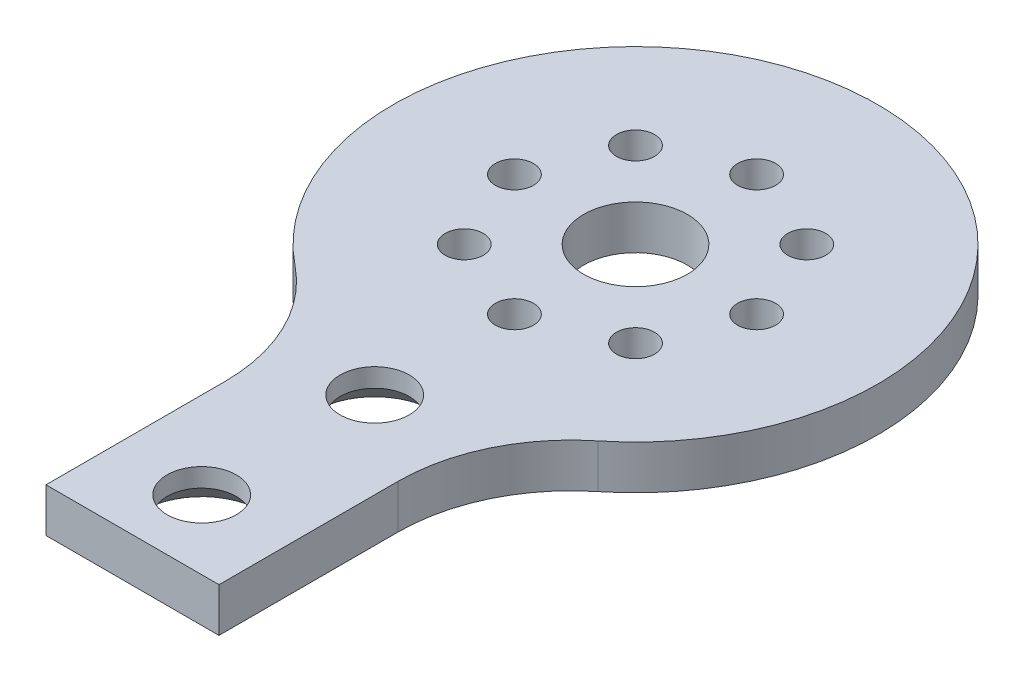
ISO-10303-21;
HEADER;
FILE_DESCRIPTION(('STEP AP214'),'2;1');
FILE_NAME('part.step','',(''),(''),'','','');
FILE_SCHEMA(('AUTOMOTIVE_DESIGN { 1 0 10303 214 1 1 1 1 }'));
ENDSEC;
DATA;
#1=APPLICATION_CONTEXT('core data for automotive mechanical design processes');
#2=APPLICATION_PROTOCOL_DEFINITION('international standard','automotive_design',2000,#1);
#3=PRODUCT_CONTEXT('',#1,'mechanical');
#4=PRODUCT('Part','Part','',(#3));
#5=PRODUCT_RELATED_PRODUCT_CATEGORY('part','',(#4));
#6=PRODUCT_DEFINITION_FORMATION('','',#4);
#7=PRODUCT_DEFINITION_CONTEXT('part definition',#1,'design');
#8=PRODUCT_DEFINITION('design','',#6,#7);
#9=PRODUCT_DEFINITION_SHAPE('','',#8);
#10=(LENGTH_UNIT() NAMED_UNIT(*) SI_UNIT(.MILLI.,.METRE.));
#11=(NAMED_UNIT(*) PLANE_ANGLE_UNIT() SI_UNIT($,.RADIAN.));
#12=(NAMED_UNIT(*) SI_UNIT($,.STERADIAN.) SOLID_ANGLE_UNIT());
#13=UNCERTAINTY_MEASURE_WITH_UNIT(LENGTH_MEASURE(1.E-05),#10,'distance_accuracy_value','');
#14=(GEOMETRIC_REPRESENTATION_CONTEXT(3) GLOBAL_UNCERTAINTY_ASSIGNED_CONTEXT((#13)) GLOBAL_UNIT_ASSIGNED_CONTEXT((#10,
#11,#12)) REPRESENTATION_CONTEXT('',''));
#15=CARTESIAN_POINT('',(0.,0.,0.));
#16=DIRECTION('',(0.,0.,1.));
#17=DIRECTION('',(1.,0.,0.));
#18=AXIS2_PLACEMENT_3D('',#15,#16,#17);
#19=CARTESIAN_POINT('',(12.5,6.35,72.6917420765551));
#20=DIRECTION('',(-1.,0.,0.));
#21=DIRECTION('',(0.,0.,1.));
#22=AXIS2_PLACEMENT_3D('',#19,#20,#21);
#23=PLANE('',#22);
#24=DIRECTION('',(0.,0.,-1.));
#25=VECTOR('',#24,1.);
#26=CARTESIAN_POINT('',(12.5,0.,72.6917420765551));
#27=LINE('',#26,#25);
#28=CARTESIAN_POINT('',(12.5,0.,72.6917420765551));
#29=VERTEX_POINT('',#28);
#30=CARTESIAN_POINT('',(12.5,0.,46.837484987988));
#31=VERTEX_POINT('',#30);
#32=EDGE_CURVE('E127',#29,#31,#27,.T.);
#33=ORIENTED_EDGE('',*,*,#32,.T.);
#34=DIRECTION('',(0.,1.,0.));
#35=VECTOR('',#34,1.);
#36=CARTESIAN_POINT('',(12.5,6.35,46.837484987988));
#37=LINE('',#36,#35);
#38=CARTESIAN_POINT('',(12.5,6.35,46.837484987988));
#39=VERTEX_POINT('',#38);
#40=EDGE_CURVE('E55',#31,#39,#37,.T.);
#41=ORIENTED_EDGE('',*,*,#40,.T.);
#42=DIRECTION('',(0.,0.,-1.));
#43=VECTOR('',#42,1.);
#44=CARTESIAN_POINT('',(12.5,6.35,72.6917420765551));
#45=LINE('',#44,#43);
#46=CARTESIAN_POINT('',(12.5,6.35,72.6917420765551));
#47=VERTEX_POINT('',#46);
#48=EDGE_CURVE('E123',#47,#39,#45,.T.);
#49=ORIENTED_EDGE('',*,*,#48,.F.);
#50=DIRECTION('',(0.,-1.,0.));
#51=VECTOR('',#50,1.);
#52=CARTESIAN_POINT('',(12.5,6.35,72.6917420765551));
#53=LINE('',#52,#51);
#54=EDGE_CURVE('E106',#47,#29,#53,.T.);
#55=ORIENTED_EDGE('',*,*,#54,.T.);
#56=EDGE_LOOP('',(#33,#41,#49,#55));
#57=FACE_BOUND('',#56,.T.);
#58=ADVANCED_FACE('F39',(#57),#23,.F.);
#59=CARTESIAN_POINT('',(0.,6.35,0.));
#60=DIRECTION('',(0.,-1.,0.));
#61=DIRECTION('',(0.,0.,-1.));
#62=AXIS2_PLACEMENT_3D('',#59,#60,#61);
#63=CYLINDRICAL_SURFACE('',#62,35.);
#64=CARTESIAN_POINT('',(0.,0.,0.));
#65=DIRECTION('',(0.,1.,0.));
#66=DIRECTION('',(0.,0.,1.));
#67=AXIS2_PLACEMENT_3D('',#64,#65,#66);
#68=CIRCLE('',#67,35.);
#69=CARTESIAN_POINT('',(21.875,0.,27.321866242993));
#70=VERTEX_POINT('',#69);
#71=CARTESIAN_POINT('',(-21.875,0.,27.321866242993));
#72=VERTEX_POINT('',#71);
#73=EDGE_CURVE('E130',#70,#72,#68,.T.);
#74=ORIENTED_EDGE('',*,*,#73,.T.);
#75=DIRECTION('',(0.,-1.,0.));
#76=VECTOR('',#75,1.);
#77=CARTESIAN_POINT('',(-21.875,6.35,27.321866242993));
#78=LINE('',#77,#76);
#79=CARTESIAN_POINT('',(-21.875,6.35,27.321866242993));
#80=VERTEX_POINT('',#79);
#81=EDGE_CURVE('E148',#72,#80,#78,.F.);
#82=ORIENTED_EDGE('',*,*,#81,.T.);
#83=CARTESIAN_POINT('',(0.,6.35,0.));
#84=DIRECTION('',(0.,1.,0.));
#85=DIRECTION('',(0.,0.,1.));
#86=AXIS2_PLACEMENT_3D('',#83,#84,#85);
#87=CIRCLE('',#86,35.);
#88=CARTESIAN_POINT('',(21.875,6.35,27.321866242993));
#89=VERTEX_POINT('',#88);
#90=EDGE_CURVE('E120',#89,#80,#87,.T.);
#91=ORIENTED_EDGE('',*,*,#90,.F.);
#92=DIRECTION('',(0.,-1.,0.));
#93=VECTOR('',#92,1.);
#94=CARTESIAN_POINT('',(21.875,6.35,27.321866242993));
#95=LINE('',#94,#93);
#96=EDGE_CURVE('E144',#89,#70,#95,.T.);
#97=ORIENTED_EDGE('',*,*,#96,.T.);
#98=EDGE_LOOP('',(#74,#82,#91,#97));
#99=FACE_BOUND('',#98,.T.);
#100=ADVANCED_FACE('F162',(#99),#63,.T.);
#101=CARTESIAN_POINT('',(-12.5,6.35,72.6917420765551));
#102=DIRECTION('',(-1.,0.,0.));
#103=DIRECTION('',(0.,0.,1.));
#104=AXIS2_PLACEMENT_3D('',#101,#102,#103);
#105=PLANE('',#104);
#106=DIRECTION('',(0.,0.,-1.));
#107=VECTOR('',#106,1.);
#108=CARTESIAN_POINT('',(-12.5,6.35,72.6917420765551));
#109=LINE('',#108,#107);
#110=CARTESIAN_POINT('',(-12.5,6.35,72.6917420765551));
#111=VERTEX_POINT('',#110);
#112=CARTESIAN_POINT('',(-12.5,6.35,46.837484987988));
#113=VERTEX_POINT('',#112);
#114=EDGE_CURVE('E98',#111,#113,#109,.T.);
#115=ORIENTED_EDGE('',*,*,#114,.T.);
#116=DIRECTION('',(0.,-1.,0.));
#117=VECTOR('',#116,1.);
#118=CARTESIAN_POINT('',(-12.5,6.35,46.837484987988));
#119=LINE('',#118,#117);
#120=CARTESIAN_POINT('',(-12.5,0.,46.837484987988));
#121=VERTEX_POINT('',#120);
#122=EDGE_CURVE('E105',#113,#121,#119,.T.);
#123=ORIENTED_EDGE('',*,*,#122,.T.);
#124=DIRECTION('',(0.,0.,-1.));
#125=VECTOR('',#124,1.);
#126=CARTESIAN_POINT('',(-12.5,0.,72.6917420765551));
#127=LINE('',#126,#125);
#128=CARTESIAN_POINT('',(-12.5,0.,72.6917420765551));
#129=VERTEX_POINT('',#128);
#130=EDGE_CURVE('E101',#129,#121,#127,.T.);
#131=ORIENTED_EDGE('',*,*,#130,.F.);
#132=DIRECTION('',(0.,-1.,0.));
#133=VECTOR('',#132,1.);
#134=CARTESIAN_POINT('',(-12.5,6.35,72.6917420765551));
#135=LINE('',#134,#133);
#136=EDGE_CURVE('E93',#111,#129,#135,.T.);
#137=ORIENTED_EDGE('',*,*,#136,.F.);
#138=EDGE_LOOP('',(#115,#123,#131,#137));
#139=FACE_BOUND('',#138,.T.);
#140=ADVANCED_FACE('F95',(#139),#105,.T.);
#141=CARTESIAN_POINT('',(-12.5,6.35,72.6917420765551));
#142=DIRECTION('',(0.,0.,-1.));
#143=DIRECTION('',(-1.,0.,0.));
#144=AXIS2_PLACEMENT_3D('',#141,#142,#143);
#145=PLANE('',#144);
#146=DIRECTION('',(1.,0.,0.));
#147=VECTOR('',#146,1.);
#148=CARTESIAN_POINT('',(-12.5,0.,72.6917420765551));
#149=LINE('',#148,#147);
#150=EDGE_CURVE('E137',#129,#29,#149,.T.);
#151=ORIENTED_EDGE('',*,*,#150,.T.);
#152=ORIENTED_EDGE('',*,*,#54,.F.);
#153=DIRECTION('',(1.,0.,0.));
#154=VECTOR('',#153,1.);
#155=CARTESIAN_POINT('',(-12.5,6.35,72.6917420765551));
#156=LINE('',#155,#154);
#157=EDGE_CURVE('E109',#111,#47,#156,.T.);
#158=ORIENTED_EDGE('',*,*,#157,.F.);
#159=ORIENTED_EDGE('',*,*,#136,.T.);
#160=EDGE_LOOP('',(#151,#152,#158,#159));
#161=FACE_BOUND('',#160,.T.);
#162=ADVANCED_FACE('F110',(#161),#145,.F.);
#163=CARTESIAN_POINT('',(0.,6.35,0.));
#164=DIRECTION('',(0.,1.,0.));
#165=DIRECTION('',(0.,0.,1.));
#166=AXIS2_PLACEMENT_3D('',#163,#164,#165);
#167=PLANE('',#166);
#168=CARTESIAN_POINT('',(0.,6.35,37.6917420765551));
#169=DIRECTION('',(0.,-1.,0.));
#170=DIRECTION('',(0.,0.,-1.));
#171=AXIS2_PLACEMENT_3D('',#168,#169,#170);
#172=CIRCLE('',#171,5.);
#173=CARTESIAN_POINT('',(0.,6.35,32.6917420765551));
#174=VERTEX_POINT('',#173);
#175=EDGE_CURVE('E276',#174,#174,#172,.T.);
#176=ORIENTED_EDGE('',*,*,#175,.T.);
#177=EDGE_LOOP('',(#176));
#178=FACE_BOUND('',#177,.T.);
#179=CARTESIAN_POINT('',(0.,6.35,62.6917420765551));
#180=DIRECTION('',(0.,-1.,0.));
#181=DIRECTION('',(0.,0.,-1.));
#182=AXIS2_PLACEMENT_3D('',#179,#180,#181);
#183=CIRCLE('',#182,5.);
#184=CARTESIAN_POINT('',(0.,6.35,57.6917420765551));
#185=VERTEX_POINT('',#184);
#186=EDGE_CURVE('E297',#185,#185,#183,.T.);
#187=ORIENTED_EDGE('',*,*,#186,.T.);
#188=EDGE_LOOP('',(#187));
#189=FACE_BOUND('',#188,.T.);
#190=CARTESIAN_POINT('',(0.,6.35,0.));
#191=DIRECTION('',(0.,-1.,0.));
#192=DIRECTION('',(0.,0.,-1.));
#193=AXIS2_PLACEMENT_3D('',#190,#191,#192);
#194=CIRCLE('',#193,7.5);
#195=CARTESIAN_POINT('',(0.,6.35,-7.5));
#196=VERTEX_POINT('',#195);
#197=EDGE_CURVE('E302',#196,#196,#194,.T.);
#198=ORIENTED_EDGE('',*,*,#197,.T.);
#199=EDGE_LOOP('',(#198));
#200=FACE_BOUND('',#199,.T.);
#201=CARTESIAN_POINT('',(0.,6.35,-17.5));
#202=DIRECTION('',(0.,-1.,0.));
#203=DIRECTION('',(0.,0.,-1.));
#204=AXIS2_PLACEMENT_3D('',#201,#202,#203);
#205=CIRCLE('',#204,2.75);
#206=CARTESIAN_POINT('',(0.,6.35,-20.25));
#207=VERTEX_POINT('',#206);
#208=EDGE_CURVE('E317',#207,#207,#205,.T.);
#209=ORIENTED_EDGE('',*,*,#208,.T.);
#210=EDGE_LOOP('',(#209));
#211=FACE_BOUND('',#210,.T.);
#212=CARTESIAN_POINT('',(-12.3743686707646,6.35,-12.3743686707646));
#213=DIRECTION('',(0.,-1.,0.));
#214=DIRECTION('',(0.,0.,-1.));
#215=AXIS2_PLACEMENT_3D('',#212,#213,#214);
#216=CIRCLE('',#215,2.75);
#217=CARTESIAN_POINT('',(-12.3743686707646,6.35,-15.1243686707646));
#218=VERTEX_POINT('',#217);
#219=EDGE_CURVE('E329',#218,#218,#216,.T.);
#220=ORIENTED_EDGE('',*,*,#219,.T.);
#221=EDGE_LOOP('',(#220));
#222=FACE_BOUND('',#221,.T.);
#223=CARTESIAN_POINT('',(-17.5,6.35,0.));
#224=DIRECTION('',(0.,-1.,0.));
#225=DIRECTION('',(0.,0.,-1.));
#226=AXIS2_PLACEMENT_3D('',#223,#224,#225);
#227=CIRCLE('',#226,2.75);
#228=CARTESIAN_POINT('',(-17.5,6.35,-2.75));
#229=VERTEX_POINT('',#228);
#230=EDGE_CURVE('E341',#229,#229,#227,.T.);
#231=ORIENTED_EDGE('',*,*,#230,.T.);
#232=EDGE_LOOP('',(#231));
#233=FACE_BOUND('',#232,.T.);
#234=CARTESIAN_POINT('',(-12.3743686707646,6.35,12.3743686707646));
#235=DIRECTION('',(0.,-1.,0.));
#236=DIRECTION('',(0.,0.,-1.));
#237=AXIS2_PLACEMENT_3D('',#234,#235,#236);
#238=CIRCLE('',#237,2.75);
#239=CARTESIAN_POINT('',(-12.3743686707646,6.35,9.62436867076458));
#240=VERTEX_POINT('',#239);
#241=EDGE_CURVE('E353',#240,#240,#238,.T.);
#242=ORIENTED_EDGE('',*,*,#241,.T.);
#243=EDGE_LOOP('',(#242));
#244=FACE_BOUND('',#243,.T.);
#245=CARTESIAN_POINT('',(0.,6.35,17.5));
#246=DIRECTION('',(0.,-1.,0.));
#247=DIRECTION('',(0.,0.,-1.));
#248=AXIS2_PLACEMENT_3D('',#245,#246,#247);
#249=CIRCLE('',#248,2.75);
#250=CARTESIAN_POINT('',(0.,6.35,14.75));
#251=VERTEX_POINT('',#250);
#252=EDGE_CURVE('E365',#251,#251,#249,.T.);
#253=ORIENTED_EDGE('',*,*,#252,.T.);
#254=EDGE_LOOP('',(#253));
#255=FACE_BOUND('',#254,.T.);
#256=CARTESIAN_POINT('',(12.3743686707646,6.35,12.3743686707646));
#257=DIRECTION('',(0.,-1.,0.));
#258=DIRECTION('',(0.,0.,-1.));
#259=AXIS2_PLACEMENT_3D('',#256,#257,#258);
#260=CIRCLE('',#259,2.75);
#261=CARTESIAN_POINT('',(12.3743686707646,6.35,9.62436867076458));
#262=VERTEX_POINT('',#261);
#263=EDGE_CURVE('E377',#262,#262,#260,.T.);
#264=ORIENTED_EDGE('',*,*,#263,.T.);
#265=EDGE_LOOP('',(#264));
#266=FACE_BOUND('',#265,.T.);
#267=CARTESIAN_POINT('',(17.5,6.35,0.));
#268=DIRECTION('',(0.,-1.,0.));
#269=DIRECTION('',(0.,0.,-1.));
#270=AXIS2_PLACEMENT_3D('',#267,#268,#269);
#271=CIRCLE('',#270,2.75);
#272=CARTESIAN_POINT('',(17.5,6.35,-2.75));
#273=VERTEX_POINT('',#272);
#274=EDGE_CURVE('E389',#273,#273,#271,.T.);
#275=ORIENTED_EDGE('',*,*,#274,.T.);
#276=EDGE_LOOP('',(#275));
#277=FACE_BOUND('',#276,.T.);
#278=CARTESIAN_POINT('',(12.3743686707646,6.35,-12.3743686707646));
#279=DIRECTION('',(0.,-1.,0.));
#280=DIRECTION('',(0.,0.,-1.));
#281=AXIS2_PLACEMENT_3D('',#278,#279,#280);
#282=CIRCLE('',#281,2.75);
#283=CARTESIAN_POINT('',(12.3743686707646,6.35,-15.1243686707646));
#284=VERTEX_POINT('',#283);
#285=EDGE_CURVE('E131',#284,#284,#282,.T.);
#286=ORIENTED_EDGE('',*,*,#285,.T.);
#287=EDGE_LOOP('',(#286));
#288=FACE_BOUND('',#287,.T.);
#289=ORIENTED_EDGE('',*,*,#48,.T.);
#290=CARTESIAN_POINT('',(37.5,6.35,46.837484987988));
#291=DIRECTION('',(0.,1.,0.));
#292=DIRECTION('',(0.,0.,1.));
#293=AXIS2_PLACEMENT_3D('',#290,#291,#292);
#294=CIRCLE('',#293,25.);
#295=EDGE_CURVE('E11',#39,#89,#294,.F.);
#296=ORIENTED_EDGE('',*,*,#295,.T.);
#297=ORIENTED_EDGE('',*,*,#90,.T.);
#298=CARTESIAN_POINT('',(-37.5,6.35,46.837484987988));
#299=DIRECTION('',(0.,1.,0.));
#300=DIRECTION('',(0.,0.,1.));
#301=AXIS2_PLACEMENT_3D('',#298,#299,#300);
#302=CIRCLE('',#301,25.);
#303=EDGE_CURVE('E118',#80,#113,#302,.F.);
#304=ORIENTED_EDGE('',*,*,#303,.T.);
#305=ORIENTED_EDGE('',*,*,#114,.F.);
#306=ORIENTED_EDGE('',*,*,#157,.T.);
#307=EDGE_LOOP('',(#289,#296,#297,#304,#305,#306));
#308=FACE_BOUND('',#307,.T.);
#309=ADVANCED_FACE('F115',(#178,#189,#200,#211,#222,#233,#244,#255,#266,#277,#288,#308),#167,.T.);
#310=CARTESIAN_POINT('',(0.,0.,0.));
#311=DIRECTION('',(0.,1.,0.));
#312=DIRECTION('',(0.,0.,1.));
#313=AXIS2_PLACEMENT_3D('',#310,#311,#312);
#314=PLANE('',#313);
#315=CARTESIAN_POINT('',(0.,0.,37.6917420765551));
#316=DIRECTION('',(0.,-1.,0.));
#317=DIRECTION('',(0.,0.,-1.));
#318=AXIS2_PLACEMENT_3D('',#315,#316,#317);
#319=CIRCLE('',#318,8.65);
#320=CARTESIAN_POINT('',(0.,0.,29.0417420765551));
#321=VERTEX_POINT('',#320);
#322=EDGE_CURVE('E281',#321,#321,#319,.T.);
#323=ORIENTED_EDGE('',*,*,#322,.F.);
#324=EDGE_LOOP('',(#323));
#325=FACE_BOUND('',#324,.T.);
#326=CARTESIAN_POINT('',(0.,0.,62.6917420765551));
#327=DIRECTION('',(0.,-1.,0.));
#328=DIRECTION('',(0.,0.,-1.));
#329=AXIS2_PLACEMENT_3D('',#326,#327,#328);
#330=CIRCLE('',#329,8.65);
#331=CARTESIAN_POINT('',(0.,0.,54.0417420765551));
#332=VERTEX_POINT('',#331);
#333=EDGE_CURVE('E285',#332,#332,#330,.T.);
#334=ORIENTED_EDGE('',*,*,#333,.F.);
#335=EDGE_LOOP('',(#334));
#336=FACE_BOUND('',#335,.T.);
#337=CARTESIAN_POINT('',(0.,0.,0.));
#338=DIRECTION('',(0.,-1.,0.));
#339=DIRECTION('',(0.,0.,-1.));
#340=AXIS2_PLACEMENT_3D('',#337,#338,#339);
#341=CIRCLE('',#340,7.5);
#342=CARTESIAN_POINT('',(0.,0.,-7.5));
#343=VERTEX_POINT('',#342);
#344=EDGE_CURVE('E301',#343,#343,#341,.T.);
#345=ORIENTED_EDGE('',*,*,#344,.F.);
#346=EDGE_LOOP('',(#345));
#347=FACE_BOUND('',#346,.T.);
#348=CARTESIAN_POINT('',(0.,0.,-17.5));
#349=DIRECTION('',(0.,-1.,0.));
#350=DIRECTION('',(0.,0.,-1.));
#351=AXIS2_PLACEMENT_3D('',#348,#349,#350);
#352=CIRCLE('',#351,2.775);
#353=CARTESIAN_POINT('',(0.,0.,-20.275));
#354=VERTEX_POINT('',#353);
#355=EDGE_CURVE('E306',#354,#354,#352,.T.);
#356=ORIENTED_EDGE('',*,*,#355,.F.);
#357=EDGE_LOOP('',(#356));
#358=FACE_BOUND('',#357,.T.);
#359=CARTESIAN_POINT('',(-12.3743686707646,0.,-12.3743686707646));
#360=DIRECTION('',(0.,-1.,0.));
#361=DIRECTION('',(0.,0.,-1.));
#362=AXIS2_PLACEMENT_3D('',#359,#360,#361);
#363=CIRCLE('',#362,2.775);
#364=CARTESIAN_POINT('',(-12.3743686707646,0.,-15.1493686707646));
#365=VERTEX_POINT('',#364);
#366=EDGE_CURVE('E321',#365,#365,#363,.T.);
#367=ORIENTED_EDGE('',*,*,#366,.F.);
#368=EDGE_LOOP('',(#367));
#369=FACE_BOUND('',#368,.T.);
#370=CARTESIAN_POINT('',(-17.5,0.,0.));
#371=DIRECTION('',(0.,-1.,0.));
#372=DIRECTION('',(0.,0.,-1.));
#373=AXIS2_PLACEMENT_3D('',#370,#371,#372);
#374=CIRCLE('',#373,2.775);
#375=CARTESIAN_POINT('',(-17.5,0.,-2.775));
#376=VERTEX_POINT('',#375);
#377=EDGE_CURVE('E333',#376,#376,#374,.T.);
#378=ORIENTED_EDGE('',*,*,#377,.F.);
#379=EDGE_LOOP('',(#378));
#380=FACE_BOUND('',#379,.T.);
#381=CARTESIAN_POINT('',(-12.3743686707646,0.,12.3743686707646));
#382=DIRECTION('',(0.,-1.,0.));
#383=DIRECTION('',(0.,0.,-1.));
#384=AXIS2_PLACEMENT_3D('',#381,#382,#383);
#385=CIRCLE('',#384,2.775);
#386=CARTESIAN_POINT('',(-12.3743686707646,0.,9.59936867076458));
#387=VERTEX_POINT('',#386);
#388=EDGE_CURVE('E345',#387,#387,#385,.T.);
#389=ORIENTED_EDGE('',*,*,#388,.F.);
#390=EDGE_LOOP('',(#389));
#391=FACE_BOUND('',#390,.T.);
#392=CARTESIAN_POINT('',(0.,0.,17.5));
#393=DIRECTION('',(0.,-1.,0.));
#394=DIRECTION('',(0.,0.,-1.));
#395=AXIS2_PLACEMENT_3D('',#392,#393,#394);
#396=CIRCLE('',#395,2.775);
#397=CARTESIAN_POINT('',(0.,0.,14.725));
#398=VERTEX_POINT('',#397);
#399=EDGE_CURVE('E357',#398,#398,#396,.T.);
#400=ORIENTED_EDGE('',*,*,#399,.F.);
#401=EDGE_LOOP('',(#400));
#402=FACE_BOUND('',#401,.T.);
#403=CARTESIAN_POINT('',(12.3743686707646,0.,12.3743686707646));
#404=DIRECTION('',(0.,-1.,0.));
#405=DIRECTION('',(0.,0.,-1.));
#406=AXIS2_PLACEMENT_3D('',#403,#404,#405);
#407=CIRCLE('',#406,2.775);
#408=CARTESIAN_POINT('',(12.3743686707646,0.,9.59936867076458));
#409=VERTEX_POINT('',#408);
#410=EDGE_CURVE('E369',#409,#409,#407,.T.);
#411=ORIENTED_EDGE('',*,*,#410,.F.);
#412=EDGE_LOOP('',(#411));
#413=FACE_BOUND('',#412,.T.);
#414=CARTESIAN_POINT('',(17.5,0.,0.));
#415=DIRECTION('',(0.,-1.,0.));
#416=DIRECTION('',(0.,0.,-1.));
#417=AXIS2_PLACEMENT_3D('',#414,#415,#416);
#418=CIRCLE('',#417,2.775);
#419=CARTESIAN_POINT('',(17.5,0.,-2.775));
#420=VERTEX_POINT('',#419);
#421=EDGE_CURVE('E381',#420,#420,#418,.T.);
#422=ORIENTED_EDGE('',*,*,#421,.F.);
#423=EDGE_LOOP('',(#422));
#424=FACE_BOUND('',#423,.T.);
#425=CARTESIAN_POINT('',(12.3743686707646,0.,-12.3743686707646));
#426=DIRECTION('',(0.,-1.,0.));
#427=DIRECTION('',(0.,0.,-1.));
#428=AXIS2_PLACEMENT_3D('',#425,#426,#427);
#429=CIRCLE('',#428,2.775);
#430=CARTESIAN_POINT('',(12.3743686707646,0.,-15.1493686707646));
#431=VERTEX_POINT('',#430);
#432=EDGE_CURVE('E393',#431,#431,#429,.T.);
#433=ORIENTED_EDGE('',*,*,#432,.F.);
#434=EDGE_LOOP('',(#433));
#435=FACE_BOUND('',#434,.T.);
#436=ORIENTED_EDGE('',*,*,#32,.F.);
#437=ORIENTED_EDGE('',*,*,#150,.F.);
#438=ORIENTED_EDGE('',*,*,#130,.T.);
#439=CARTESIAN_POINT('',(-37.5,0.,46.837484987988));
#440=DIRECTION('',(0.,1.,0.));
#441=DIRECTION('',(0.,0.,1.));
#442=AXIS2_PLACEMENT_3D('',#439,#440,#441);
#443=CIRCLE('',#442,25.);
#444=EDGE_CURVE('E153',#121,#72,#443,.T.);
#445=ORIENTED_EDGE('',*,*,#444,.T.);
#446=ORIENTED_EDGE('',*,*,#73,.F.);
#447=CARTESIAN_POINT('',(37.5,0.,46.837484987988));
#448=DIRECTION('',(0.,1.,0.));
#449=DIRECTION('',(0.,0.,1.));
#450=AXIS2_PLACEMENT_3D('',#447,#448,#449);
#451=CIRCLE('',#450,25.);
#452=EDGE_CURVE('E48',#70,#31,#451,.T.);
#453=ORIENTED_EDGE('',*,*,#452,.T.);
#454=EDGE_LOOP('',(#436,#437,#438,#445,#446,#453));
#455=FACE_BOUND('',#454,.T.);
#456=ADVANCED_FACE('F158',(#325,#336,#347,#358,#369,#380,#391,#402,#413,#424,#435,#455),#314,.F.);
#457=CARTESIAN_POINT('',(12.3743686707646,0.,-12.3743686707646));
#458=DIRECTION('',(0.,-1.,0.));
#459=DIRECTION('',(0.,0.,-1.));
#460=AXIS2_PLACEMENT_3D('',#457,#458,#459);
#461=CYLINDRICAL_SURFACE('',#460,2.75);
#462=ORIENTED_EDGE('',*,*,#285,.F.);
#463=EDGE_LOOP('',(#462));
#464=FACE_BOUND('',#463,.T.);
#465=CARTESIAN_POINT('',(12.3743686707646,0.0249999999999998,-12.3743686707646));
#466=DIRECTION('',(0.,-1.,0.));
#467=DIRECTION('',(0.,0.,-1.));
#468=AXIS2_PLACEMENT_3D('',#465,#466,#467);
#469=CIRCLE('',#468,2.75);
#470=CARTESIAN_POINT('',(12.3743686707646,0.0249999999999998,-15.1243686707646));
#471=VERTEX_POINT('',#470);
#472=EDGE_CURVE('E397',#471,#471,#469,.T.);
#473=ORIENTED_EDGE('',*,*,#472,.T.);
#474=EDGE_LOOP('',(#473));
#475=FACE_BOUND('',#474,.T.);
#476=ADVANCED_FACE('F189',(#464,#475),#461,.F.);
#477=CARTESIAN_POINT('',(12.3743686707646,0.,-12.3743686707646));
#478=DIRECTION('',(0.,-1.,0.));
#479=DIRECTION('',(0.,0.,-1.));
#480=AXIS2_PLACEMENT_3D('',#477,#478,#479);
#481=CONICAL_SURFACE('',#480,2.775,0.785398163397431);
#482=ORIENTED_EDGE('',*,*,#472,.F.);
#483=EDGE_LOOP('',(#482));
#484=FACE_BOUND('',#483,.T.);
#485=ORIENTED_EDGE('',*,*,#432,.T.);
#486=EDGE_LOOP('',(#485));
#487=FACE_BOUND('',#486,.T.);
#488=ADVANCED_FACE('F196',(#484,#487),#481,.F.);
#489=CARTESIAN_POINT('',(17.5,0.,0.));
#490=DIRECTION('',(0.,-1.,0.));
#491=DIRECTION('',(0.,0.,-1.));
#492=AXIS2_PLACEMENT_3D('',#489,#490,#491);
#493=CYLINDRICAL_SURFACE('',#492,2.75);
#494=ORIENTED_EDGE('',*,*,#274,.F.);
#495=EDGE_LOOP('',(#494));
#496=FACE_BOUND('',#495,.T.);
#497=CARTESIAN_POINT('',(17.5,0.0249999999999998,0.));
#498=DIRECTION('',(0.,-1.,0.));
#499=DIRECTION('',(0.,0.,-1.));
#500=AXIS2_PLACEMENT_3D('',#497,#498,#499);
#501=CIRCLE('',#500,2.75);
#502=CARTESIAN_POINT('',(17.5,0.0249999999999998,-2.75));
#503=VERTEX_POINT('',#502);
#504=EDGE_CURVE('E385',#503,#503,#501,.T.);
#505=ORIENTED_EDGE('',*,*,#504,.T.);
#506=EDGE_LOOP('',(#505));
#507=FACE_BOUND('',#506,.T.);
#508=ADVANCED_FACE('F200',(#496,#507),#493,.F.);
#509=CARTESIAN_POINT('',(17.5,0.,0.));
#510=DIRECTION('',(0.,-1.,0.));
#511=DIRECTION('',(0.,0.,-1.));
#512=AXIS2_PLACEMENT_3D('',#509,#510,#511);
#513=CONICAL_SURFACE('',#512,2.775,0.785398163397466);
#514=ORIENTED_EDGE('',*,*,#504,.F.);
#515=EDGE_LOOP('',(#514));
#516=FACE_BOUND('',#515,.T.);
#517=ORIENTED_EDGE('',*,*,#421,.T.);
#518=EDGE_LOOP('',(#517));
#519=FACE_BOUND('',#518,.T.);
#520=ADVANCED_FACE('F204',(#516,#519),#513,.F.);
#521=CARTESIAN_POINT('',(12.3743686707646,0.,12.3743686707646));
#522=DIRECTION('',(0.,-1.,0.));
#523=DIRECTION('',(0.,0.,-1.));
#524=AXIS2_PLACEMENT_3D('',#521,#522,#523);
#525=CYLINDRICAL_SURFACE('',#524,2.75);
#526=ORIENTED_EDGE('',*,*,#263,.F.);
#527=EDGE_LOOP('',(#526));
#528=FACE_BOUND('',#527,.T.);
#529=CARTESIAN_POINT('',(12.3743686707646,0.0249999999999998,12.3743686707646));
#530=DIRECTION('',(0.,-1.,0.));
#531=DIRECTION('',(0.,0.,-1.));
#532=AXIS2_PLACEMENT_3D('',#529,#530,#531);
#533=CIRCLE('',#532,2.75);
#534=CARTESIAN_POINT('',(12.3743686707646,0.0249999999999998,9.62436867076458));
#535=VERTEX_POINT('',#534);
#536=EDGE_CURVE('E373',#535,#535,#533,.T.);
#537=ORIENTED_EDGE('',*,*,#536,.T.);
#538=EDGE_LOOP('',(#537));
#539=FACE_BOUND('',#538,.T.);
#540=ADVANCED_FACE('F208',(#528,#539),#525,.F.);
#541=CARTESIAN_POINT('',(12.3743686707646,0.,12.3743686707646));
#542=DIRECTION('',(0.,-1.,0.));
#543=DIRECTION('',(0.,0.,-1.));
#544=AXIS2_PLACEMENT_3D('',#541,#542,#543);
#545=CONICAL_SURFACE('',#544,2.775,0.785398163397431);
#546=ORIENTED_EDGE('',*,*,#536,.F.);
#547=EDGE_LOOP('',(#546));
#548=FACE_BOUND('',#547,.T.);
#549=ORIENTED_EDGE('',*,*,#410,.T.);
#550=EDGE_LOOP('',(#549));
#551=FACE_BOUND('',#550,.T.);
#552=ADVANCED_FACE('F212',(#548,#551),#545,.F.);
#553=CARTESIAN_POINT('',(0.,0.,17.5));
#554=DIRECTION('',(0.,-1.,0.));
#555=DIRECTION('',(0.,0.,-1.));
#556=AXIS2_PLACEMENT_3D('',#553,#554,#555);
#557=CYLINDRICAL_SURFACE('',#556,2.75);
#558=ORIENTED_EDGE('',*,*,#252,.F.);
#559=EDGE_LOOP('',(#558));
#560=FACE_BOUND('',#559,.T.);
#561=CARTESIAN_POINT('',(0.,0.0249999999999998,17.5));
#562=DIRECTION('',(0.,-1.,0.));
#563=DIRECTION('',(0.,0.,-1.));
#564=AXIS2_PLACEMENT_3D('',#561,#562,#563);
#565=CIRCLE('',#564,2.75);
#566=CARTESIAN_POINT('',(0.,0.0249999999999998,14.75));
#567=VERTEX_POINT('',#566);
#568=EDGE_CURVE('E361',#567,#567,#565,.T.);
#569=ORIENTED_EDGE('',*,*,#568,.T.);
#570=EDGE_LOOP('',(#569));
#571=FACE_BOUND('',#570,.T.);
#572=ADVANCED_FACE('F216',(#560,#571),#557,.F.);
#573=CARTESIAN_POINT('',(0.,0.,17.5));
#574=DIRECTION('',(0.,-1.,0.));
#575=DIRECTION('',(0.,0.,-1.));
#576=AXIS2_PLACEMENT_3D('',#573,#574,#575);
#577=CONICAL_SURFACE('',#576,2.775,0.785398163397457);
#578=ORIENTED_EDGE('',*,*,#568,.F.);
#579=EDGE_LOOP('',(#578));
#580=FACE_BOUND('',#579,.T.);
#581=ORIENTED_EDGE('',*,*,#399,.T.);
#582=EDGE_LOOP('',(#581));
#583=FACE_BOUND('',#582,.T.);
#584=ADVANCED_FACE('F220',(#580,#583),#577,.F.);
#585=CARTESIAN_POINT('',(-12.3743686707646,0.,12.3743686707646));
#586=DIRECTION('',(0.,-1.,0.));
#587=DIRECTION('',(0.,0.,-1.));
#588=AXIS2_PLACEMENT_3D('',#585,#586,#587);
#589=CYLINDRICAL_SURFACE('',#588,2.75);
#590=ORIENTED_EDGE('',*,*,#241,.F.);
#591=EDGE_LOOP('',(#590));
#592=FACE_BOUND('',#591,.T.);
#593=CARTESIAN_POINT('',(-12.3743686707646,0.0249999999999998,12.3743686707646));
#594=DIRECTION('',(0.,-1.,0.));
#595=DIRECTION('',(0.,0.,-1.));
#596=AXIS2_PLACEMENT_3D('',#593,#594,#595);
#597=CIRCLE('',#596,2.75);
#598=CARTESIAN_POINT('',(-12.3743686707646,0.0249999999999998,9.62436867076458));
#599=VERTEX_POINT('',#598);
#600=EDGE_CURVE('E349',#599,#599,#597,.T.);
#601=ORIENTED_EDGE('',*,*,#600,.T.);
#602=EDGE_LOOP('',(#601));
#603=FACE_BOUND('',#602,.T.);
#604=ADVANCED_FACE('F224',(#592,#603),#589,.F.);
#605=CARTESIAN_POINT('',(-12.3743686707646,0.,12.3743686707646));
#606=DIRECTION('',(0.,-1.,0.));
#607=DIRECTION('',(0.,0.,-1.));
#608=AXIS2_PLACEMENT_3D('',#605,#606,#607);
#609=CONICAL_SURFACE('',#608,2.775,0.785398163397466);
#610=ORIENTED_EDGE('',*,*,#600,.F.);
#611=EDGE_LOOP('',(#610));
#612=FACE_BOUND('',#611,.T.);
#613=ORIENTED_EDGE('',*,*,#388,.T.);
#614=EDGE_LOOP('',(#613));
#615=FACE_BOUND('',#614,.T.);
#616=ADVANCED_FACE('F228',(#612,#615),#609,.F.);
#617=CARTESIAN_POINT('',(-17.5,0.,0.));
#618=DIRECTION('',(0.,-1.,0.));
#619=DIRECTION('',(0.,0.,-1.));
#620=AXIS2_PLACEMENT_3D('',#617,#618,#619);
#621=CYLINDRICAL_SURFACE('',#620,2.75);
#622=ORIENTED_EDGE('',*,*,#230,.F.);
#623=EDGE_LOOP('',(#622));
#624=FACE_BOUND('',#623,.T.);
#625=CARTESIAN_POINT('',(-17.5,0.0249999999999998,0.));
#626=DIRECTION('',(0.,-1.,0.));
#627=DIRECTION('',(0.,0.,-1.));
#628=AXIS2_PLACEMENT_3D('',#625,#626,#627);
#629=CIRCLE('',#628,2.75);
#630=CARTESIAN_POINT('',(-17.5,0.0249999999999998,-2.75));
#631=VERTEX_POINT('',#630);
#632=EDGE_CURVE('E337',#631,#631,#629,.T.);
#633=ORIENTED_EDGE('',*,*,#632,.T.);
#634=EDGE_LOOP('',(#633));
#635=FACE_BOUND('',#634,.T.);
#636=ADVANCED_FACE('F232',(#624,#635),#621,.F.);
#637=CARTESIAN_POINT('',(-17.5,0.,0.));
#638=DIRECTION('',(0.,-1.,0.));
#639=DIRECTION('',(0.,0.,-1.));
#640=AXIS2_PLACEMENT_3D('',#637,#638,#639);
#641=CONICAL_SURFACE('',#640,2.775,0.785398163397466);
#642=ORIENTED_EDGE('',*,*,#632,.F.);
#643=EDGE_LOOP('',(#642));
#644=FACE_BOUND('',#643,.T.);
#645=ORIENTED_EDGE('',*,*,#377,.T.);
#646=EDGE_LOOP('',(#645));
#647=FACE_BOUND('',#646,.T.);
#648=ADVANCED_FACE('F236',(#644,#647),#641,.F.);
#649=CARTESIAN_POINT('',(-12.3743686707646,0.,-12.3743686707646));
#650=DIRECTION('',(0.,-1.,0.));
#651=DIRECTION('',(0.,0.,-1.));
#652=AXIS2_PLACEMENT_3D('',#649,#650,#651);
#653=CYLINDRICAL_SURFACE('',#652,2.75);
#654=ORIENTED_EDGE('',*,*,#219,.F.);
#655=EDGE_LOOP('',(#654));
#656=FACE_BOUND('',#655,.T.);
#657=CARTESIAN_POINT('',(-12.3743686707646,0.0249999999999998,-12.3743686707646));
#658=DIRECTION('',(0.,-1.,0.));
#659=DIRECTION('',(0.,0.,-1.));
#660=AXIS2_PLACEMENT_3D('',#657,#658,#659);
#661=CIRCLE('',#660,2.75);
#662=CARTESIAN_POINT('',(-12.3743686707646,0.0249999999999998,-15.1243686707646));
#663=VERTEX_POINT('',#662);
#664=EDGE_CURVE('E325',#663,#663,#661,.T.);
#665=ORIENTED_EDGE('',*,*,#664,.T.);
#666=EDGE_LOOP('',(#665));
#667=FACE_BOUND('',#666,.T.);
#668=ADVANCED_FACE('F240',(#656,#667),#653,.F.);
#669=CARTESIAN_POINT('',(-12.3743686707646,0.,-12.3743686707646));
#670=DIRECTION('',(0.,-1.,0.));
#671=DIRECTION('',(0.,0.,-1.));
#672=AXIS2_PLACEMENT_3D('',#669,#670,#671);
#673=CONICAL_SURFACE('',#672,2.775,0.785398163397431);
#674=ORIENTED_EDGE('',*,*,#664,.F.);
#675=EDGE_LOOP('',(#674));
#676=FACE_BOUND('',#675,.T.);
#677=ORIENTED_EDGE('',*,*,#366,.T.);
#678=EDGE_LOOP('',(#677));
#679=FACE_BOUND('',#678,.T.);
#680=ADVANCED_FACE('F244',(#676,#679),#673,.F.);
#681=CARTESIAN_POINT('',(0.,0.,-17.5));
#682=DIRECTION('',(0.,-1.,0.));
#683=DIRECTION('',(0.,0.,-1.));
#684=AXIS2_PLACEMENT_3D('',#681,#682,#683);
#685=CYLINDRICAL_SURFACE('',#684,2.75);
#686=ORIENTED_EDGE('',*,*,#208,.F.);
#687=EDGE_LOOP('',(#686));
#688=FACE_BOUND('',#687,.T.);
#689=CARTESIAN_POINT('',(0.,0.0249999999999998,-17.5));
#690=DIRECTION('',(0.,-1.,0.));
#691=DIRECTION('',(0.,0.,-1.));
#692=AXIS2_PLACEMENT_3D('',#689,#690,#691);
#693=CIRCLE('',#692,2.75);
#694=CARTESIAN_POINT('',(0.,0.0249999999999998,-20.25));
#695=VERTEX_POINT('',#694);
#696=EDGE_CURVE('E313',#695,#695,#693,.T.);
#697=ORIENTED_EDGE('',*,*,#696,.T.);
#698=EDGE_LOOP('',(#697));
#699=FACE_BOUND('',#698,.T.);
#700=ADVANCED_FACE('F248',(#688,#699),#685,.F.);
#701=CARTESIAN_POINT('',(0.,0.,-17.5));
#702=DIRECTION('',(0.,-1.,0.));
#703=DIRECTION('',(0.,0.,-1.));
#704=AXIS2_PLACEMENT_3D('',#701,#702,#703);
#705=CONICAL_SURFACE('',#704,2.775,0.785398163397457);
#706=ORIENTED_EDGE('',*,*,#696,.F.);
#707=EDGE_LOOP('',(#706));
#708=FACE_BOUND('',#707,.T.);
#709=ORIENTED_EDGE('',*,*,#355,.T.);
#710=EDGE_LOOP('',(#709));
#711=FACE_BOUND('',#710,.T.);
#712=ADVANCED_FACE('F252',(#708,#711),#705,.F.);
#713=CARTESIAN_POINT('',(0.,6.35,0.));
#714=DIRECTION('',(0.,-1.,0.));
#715=DIRECTION('',(0.,0.,-1.));
#716=AXIS2_PLACEMENT_3D('',#713,#714,#715);
#717=CYLINDRICAL_SURFACE('',#716,7.5);
#718=ORIENTED_EDGE('',*,*,#197,.F.);
#719=EDGE_LOOP('',(#718));
#720=FACE_BOUND('',#719,.T.);
#721=ORIENTED_EDGE('',*,*,#344,.T.);
#722=EDGE_LOOP('',(#721));
#723=FACE_BOUND('',#722,.T.);
#724=ADVANCED_FACE('F256',(#720,#723),#717,.F.);
#725=CARTESIAN_POINT('',(0.,0.,62.6917420765551));
#726=DIRECTION('',(0.,-1.,0.));
#727=DIRECTION('',(0.,0.,-1.));
#728=AXIS2_PLACEMENT_3D('',#725,#726,#727);
#729=CYLINDRICAL_SURFACE('',#728,5.);
#730=ORIENTED_EDGE('',*,*,#186,.F.);
#731=EDGE_LOOP('',(#730));
#732=FACE_BOUND('',#731,.T.);
#733=CARTESIAN_POINT('',(0.,3.65,62.6917420765551));
#734=DIRECTION('',(0.,-1.,0.));
#735=DIRECTION('',(0.,0.,-1.));
#736=AXIS2_PLACEMENT_3D('',#733,#734,#735);
#737=CIRCLE('',#736,5.);
#738=CARTESIAN_POINT('',(0.,3.65,57.6917420765551));
#739=VERTEX_POINT('',#738);
#740=EDGE_CURVE('E293',#739,#739,#737,.T.);
#741=ORIENTED_EDGE('',*,*,#740,.T.);
#742=EDGE_LOOP('',(#741));
#743=FACE_BOUND('',#742,.T.);
#744=ADVANCED_FACE('F260',(#732,#743),#729,.F.);
#745=CARTESIAN_POINT('',(0.,0.,62.6917420765551));
#746=DIRECTION('',(0.,-1.,0.));
#747=DIRECTION('',(0.,0.,-1.));
#748=AXIS2_PLACEMENT_3D('',#745,#746,#747);
#749=CONICAL_SURFACE('',#748,8.65,0.785398163397449);
#750=ORIENTED_EDGE('',*,*,#740,.F.);
#751=EDGE_LOOP('',(#750));
#752=FACE_BOUND('',#751,.T.);
#753=ORIENTED_EDGE('',*,*,#333,.T.);
#754=EDGE_LOOP('',(#753));
#755=FACE_BOUND('',#754,.T.);
#756=ADVANCED_FACE('F264',(#752,#755),#749,.F.);
#757=CARTESIAN_POINT('',(0.,0.,37.6917420765551));
#758=DIRECTION('',(0.,-1.,0.));
#759=DIRECTION('',(0.,0.,-1.));
#760=AXIS2_PLACEMENT_3D('',#757,#758,#759);
#761=CYLINDRICAL_SURFACE('',#760,5.);
#762=ORIENTED_EDGE('',*,*,#175,.F.);
#763=EDGE_LOOP('',(#762));
#764=FACE_BOUND('',#763,.T.);
#765=CARTESIAN_POINT('',(0.,3.65,37.6917420765551));
#766=DIRECTION('',(0.,-1.,0.));
#767=DIRECTION('',(0.,0.,-1.));
#768=AXIS2_PLACEMENT_3D('',#765,#766,#767);
#769=CIRCLE('',#768,5.);
#770=CARTESIAN_POINT('',(0.,3.65,32.6917420765551));
#771=VERTEX_POINT('',#770);
#772=EDGE_CURVE('E279',#771,#771,#769,.T.);
#773=ORIENTED_EDGE('',*,*,#772,.T.);
#774=EDGE_LOOP('',(#773));
#775=FACE_BOUND('',#774,.T.);
#776=ADVANCED_FACE('F173',(#764,#775),#761,.F.);
#777=CARTESIAN_POINT('',(0.,0.,37.6917420765551));
#778=DIRECTION('',(0.,-1.,0.));
#779=DIRECTION('',(0.,0.,-1.));
#780=AXIS2_PLACEMENT_3D('',#777,#778,#779);
#781=CONICAL_SURFACE('',#780,8.65,0.785398163397449);
#782=ORIENTED_EDGE('',*,*,#772,.F.);
#783=EDGE_LOOP('',(#782));
#784=FACE_BOUND('',#783,.T.);
#785=ORIENTED_EDGE('',*,*,#322,.T.);
#786=EDGE_LOOP('',(#785));
#787=FACE_BOUND('',#786,.T.);
#788=ADVANCED_FACE('F167',(#784,#787),#781,.F.);
#789=CARTESIAN_POINT('',(-37.5,6.35,46.837484987988));
#790=DIRECTION('',(0.,-1.,0.));
#791=DIRECTION('',(0.,0.,-1.));
#792=AXIS2_PLACEMENT_3D('',#789,#790,#791);
#793=CYLINDRICAL_SURFACE('',#792,25.);
#794=ORIENTED_EDGE('',*,*,#303,.F.);
#795=ORIENTED_EDGE('',*,*,#81,.F.);
#796=ORIENTED_EDGE('',*,*,#444,.F.);
#797=ORIENTED_EDGE('',*,*,#122,.F.);
#798=EDGE_LOOP('',(#794,#795,#796,#797));
#799=FACE_BOUND('',#798,.T.);
#800=ADVANCED_FACE('F165',(#799),#793,.F.);
#801=CARTESIAN_POINT('',(37.5,6.35,46.837484987988));
#802=DIRECTION('',(0.,-1.,0.));
#803=DIRECTION('',(0.,0.,-1.));
#804=AXIS2_PLACEMENT_3D('',#801,#802,#803);
#805=CYLINDRICAL_SURFACE('',#804,25.);
#806=ORIENTED_EDGE('',*,*,#295,.F.);
#807=ORIENTED_EDGE('',*,*,#40,.F.);
#808=ORIENTED_EDGE('',*,*,#452,.F.);
#809=ORIENTED_EDGE('',*,*,#96,.F.);
#810=EDGE_LOOP('',(#806,#807,#808,#809));
#811=FACE_BOUND('',#810,.T.);
#812=ADVANCED_FACE('F41',(#811),#805,.F.);
#813=CLOSED_SHELL('',(#58,#100,#140,#162,#309,#456,#476,#488,#508,#520,#540,#552,#572,#584,#604,
#616,#636,#648,#668,#680,#700,#712,#724,#744,#756,#776,#788,#800,#812));
#814=MANIFOLD_SOLID_BREP('B2',#813);
#815=ADVANCED_BREP_SHAPE_REPRESENTATION('',(#18,#814),#14);
#816=SHAPE_DEFINITION_REPRESENTATION(#9,#815);
ENDSEC;
END-ISO-10303-21;
